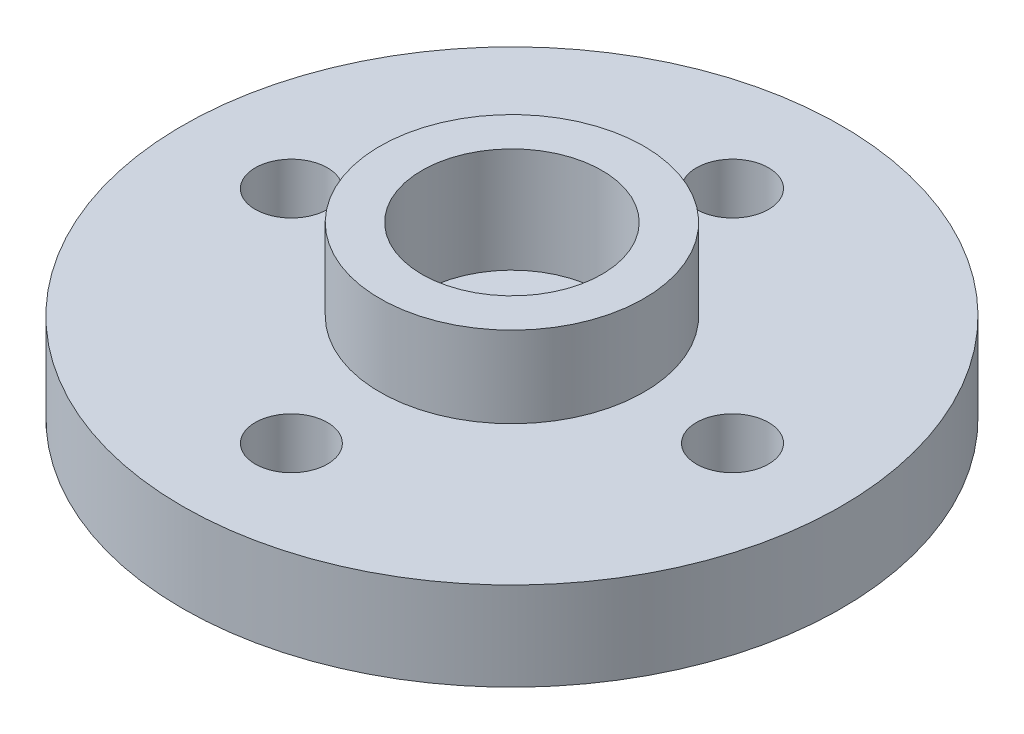
ISO-10303-21;
HEADER;
FILE_DESCRIPTION(('STEP AP214'),'2;1');
FILE_NAME('part.step','',(''),(''),'','','');
FILE_SCHEMA(('AUTOMOTIVE_DESIGN { 1 0 10303 214 1 1 1 1 }'));
ENDSEC;
DATA;
#1=APPLICATION_CONTEXT('core data for automotive mechanical design processes');
#2=APPLICATION_PROTOCOL_DEFINITION('international standard','automotive_design',2000,#1);
#3=PRODUCT_CONTEXT('',#1,'mechanical');
#4=PRODUCT('Part','Part','',(#3));
#5=PRODUCT_RELATED_PRODUCT_CATEGORY('part','',(#4));
#6=PRODUCT_DEFINITION_FORMATION('','',#4);
#7=PRODUCT_DEFINITION_CONTEXT('part definition',#1,'design');
#8=PRODUCT_DEFINITION('design','',#6,#7);
#9=PRODUCT_DEFINITION_SHAPE('','',#8);
#10=(LENGTH_UNIT() NAMED_UNIT(*) SI_UNIT(.MILLI.,.METRE.));
#11=(NAMED_UNIT(*) PLANE_ANGLE_UNIT() SI_UNIT($,.RADIAN.));
#12=(NAMED_UNIT(*) SI_UNIT($,.STERADIAN.) SOLID_ANGLE_UNIT());
#13=UNCERTAINTY_MEASURE_WITH_UNIT(LENGTH_MEASURE(1.E-05),#10,'distance_accuracy_value','');
#14=(GEOMETRIC_REPRESENTATION_CONTEXT(3) GLOBAL_UNCERTAINTY_ASSIGNED_CONTEXT((#13)) GLOBAL_UNIT_ASSIGNED_CONTEXT((#10,
#11,#12)) REPRESENTATION_CONTEXT('',''));
#15=CARTESIAN_POINT('',(0.,0.,0.));
#16=DIRECTION('',(0.,0.,1.));
#17=DIRECTION('',(1.,0.,0.));
#18=AXIS2_PLACEMENT_3D('',#15,#16,#17);
#19=CARTESIAN_POINT('',(0.,2.95,0.));
#20=DIRECTION('',(0.,-1.,0.));
#21=DIRECTION('',(0.,0.,-1.));
#22=AXIS2_PLACEMENT_3D('',#19,#20,#21);
#23=CYLINDRICAL_SURFACE('',#22,1.5689031227011);
#24=CARTESIAN_POINT('',(0.,1.05,0.));
#25=DIRECTION('',(0.,1.,0.));
#26=DIRECTION('',(0.,0.,1.));
#27=AXIS2_PLACEMENT_3D('',#24,#25,#26);
#28=CIRCLE('',#27,1.5689031227011);
#29=CARTESIAN_POINT('',(0.,1.05,1.5689031227011));
#30=VERTEX_POINT('',#29);
#31=EDGE_CURVE('E48',#30,#30,#28,.T.);
#32=ORIENTED_EDGE('',*,*,#31,.F.);
#33=EDGE_LOOP('',(#32));
#34=FACE_BOUND('',#33,.T.);
#35=CARTESIAN_POINT('',(0.,2.15,0.));
#36=DIRECTION('',(0.,1.,0.));
#37=DIRECTION('',(0.,0.,1.));
#38=AXIS2_PLACEMENT_3D('',#35,#36,#37);
#39=CIRCLE('',#38,1.5689031227011);
#40=CARTESIAN_POINT('',(0.,2.15,1.5689031227011));
#41=VERTEX_POINT('',#40);
#42=EDGE_CURVE('E34',#41,#41,#39,.T.);
#43=ORIENTED_EDGE('',*,*,#42,.T.);
#44=EDGE_LOOP('',(#43));
#45=FACE_BOUND('',#44,.T.);
#46=ADVANCED_FACE('F30',(#34,#45),#23,.F.);
#47=CARTESIAN_POINT('',(0.,2.95,0.));
#48=DIRECTION('',(0.,-1.,0.));
#49=DIRECTION('',(0.,0.,-1.));
#50=AXIS2_PLACEMENT_3D('',#47,#48,#49);
#51=CYLINDRICAL_SURFACE('',#50,10.9823218589077);
#52=CARTESIAN_POINT('',(0.,2.95,0.));
#53=DIRECTION('',(0.,1.,0.));
#54=DIRECTION('',(0.,0.,1.));
#55=AXIS2_PLACEMENT_3D('',#52,#53,#54);
#56=CIRCLE('',#55,10.9823218589077);
#57=CARTESIAN_POINT('',(0.,2.95,10.9823218589077));
#58=VERTEX_POINT('',#57);
#59=EDGE_CURVE('E10',#58,#58,#56,.T.);
#60=ORIENTED_EDGE('',*,*,#59,.F.);
#61=EDGE_LOOP('',(#60));
#62=FACE_BOUND('',#61,.T.);
#63=CARTESIAN_POINT('',(0.,0.,0.));
#64=DIRECTION('',(0.,1.,0.));
#65=DIRECTION('',(0.,0.,1.));
#66=AXIS2_PLACEMENT_3D('',#63,#64,#65);
#67=CIRCLE('',#66,10.9823218589077);
#68=CARTESIAN_POINT('',(0.,0.,10.9823218589077));
#69=VERTEX_POINT('',#68);
#70=EDGE_CURVE('E38',#69,#69,#67,.T.);
#71=ORIENTED_EDGE('',*,*,#70,.T.);
#72=EDGE_LOOP('',(#71));
#73=FACE_BOUND('',#72,.T.);
#74=ADVANCED_FACE('F32',(#62,#73),#51,.T.);
#75=CARTESIAN_POINT('',(0.,2.95,0.));
#76=DIRECTION('',(0.,1.,0.));
#77=DIRECTION('',(0.,0.,1.));
#78=AXIS2_PLACEMENT_3D('',#75,#76,#77);
#79=PLANE('',#78);
#80=CARTESIAN_POINT('',(0.,2.95,0.));
#81=DIRECTION('',(0.,1.,0.));
#82=DIRECTION('',(0.,0.,1.));
#83=AXIS2_PLACEMENT_3D('',#80,#81,#82);
#84=CIRCLE('',#83,4.4);
#85=CARTESIAN_POINT('',(0.,2.95,-4.4));
#86=VERTEX_POINT('',#85);
#87=EDGE_CURVE('E66',#86,#86,#84,.T.);
#88=ORIENTED_EDGE('',*,*,#87,.F.);
#89=EDGE_LOOP('',(#88));
#90=FACE_BOUND('',#89,.T.);
#91=CARTESIAN_POINT('',(7.35,2.95,0.));
#92=DIRECTION('',(0.,1.,0.));
#93=DIRECTION('',(0.,0.,1.));
#94=AXIS2_PLACEMENT_3D('',#91,#92,#93);
#95=CIRCLE('',#94,1.20282572740417);
#96=CARTESIAN_POINT('',(7.35,2.95,1.20282572740423));
#97=VERTEX_POINT('',#96);
#98=EDGE_CURVE('E43',#97,#97,#95,.T.);
#99=ORIENTED_EDGE('',*,*,#98,.F.);
#100=EDGE_LOOP('',(#99));
#101=FACE_BOUND('',#100,.T.);
#102=CARTESIAN_POINT('',(0.,2.95,7.35));
#103=DIRECTION('',(0.,1.,0.));
#104=DIRECTION('',(0.,0.,1.));
#105=AXIS2_PLACEMENT_3D('',#102,#103,#104);
#106=CIRCLE('',#105,1.20282572740417);
#107=CARTESIAN_POINT('',(0.,2.95,8.55282572740417));
#108=VERTEX_POINT('',#107);
#109=EDGE_CURVE('E50',#108,#108,#106,.T.);
#110=ORIENTED_EDGE('',*,*,#109,.F.);
#111=EDGE_LOOP('',(#110));
#112=FACE_BOUND('',#111,.T.);
#113=CARTESIAN_POINT('',(-7.35,2.95,0.));
#114=DIRECTION('',(0.,1.,0.));
#115=DIRECTION('',(0.,0.,1.));
#116=AXIS2_PLACEMENT_3D('',#113,#114,#115);
#117=CIRCLE('',#116,1.20282572740417);
#118=CARTESIAN_POINT('',(-7.35,2.95,1.20282572740417));
#119=VERTEX_POINT('',#118);
#120=EDGE_CURVE('E78',#119,#119,#117,.T.);
#121=ORIENTED_EDGE('',*,*,#120,.F.);
#122=EDGE_LOOP('',(#121));
#123=FACE_BOUND('',#122,.T.);
#124=CARTESIAN_POINT('',(0.,2.95,-7.35));
#125=DIRECTION('',(0.,1.,0.));
#126=DIRECTION('',(0.,0.,1.));
#127=AXIS2_PLACEMENT_3D('',#124,#125,#126);
#128=CIRCLE('',#127,1.20282572740417);
#129=CARTESIAN_POINT('',(0.,2.95,-6.14717427259582));
#130=VERTEX_POINT('',#129);
#131=EDGE_CURVE('E46',#130,#130,#128,.T.);
#132=ORIENTED_EDGE('',*,*,#131,.F.);
#133=EDGE_LOOP('',(#132));
#134=FACE_BOUND('',#133,.T.);
#135=ORIENTED_EDGE('',*,*,#59,.T.);
#136=EDGE_LOOP('',(#135));
#137=FACE_BOUND('',#136,.T.);
#138=ADVANCED_FACE('F91',(#90,#101,#112,#123,#134,#137),#79,.T.);
#139=CARTESIAN_POINT('',(0.,0.,0.));
#140=DIRECTION('',(0.,1.,0.));
#141=DIRECTION('',(0.,0.,1.));
#142=AXIS2_PLACEMENT_3D('',#139,#140,#141);
#143=PLANE('',#142);
#144=CARTESIAN_POINT('',(0.,0.,0.));
#145=DIRECTION('',(0.,1.,0.));
#146=DIRECTION('',(0.,0.,1.));
#147=AXIS2_PLACEMENT_3D('',#144,#145,#146);
#148=CIRCLE('',#147,3.13780624540219);
#149=CARTESIAN_POINT('',(0.,0.,3.13780624540219));
#150=VERTEX_POINT('',#149);
#151=EDGE_CURVE('E58',#150,#150,#148,.T.);
#152=ORIENTED_EDGE('',*,*,#151,.T.);
#153=EDGE_LOOP('',(#152));
#154=FACE_BOUND('',#153,.T.);
#155=CARTESIAN_POINT('',(7.35,0.,0.));
#156=DIRECTION('',(0.,1.,0.));
#157=DIRECTION('',(0.,0.,1.));
#158=AXIS2_PLACEMENT_3D('',#155,#156,#157);
#159=CIRCLE('',#158,1.20282572740417);
#160=CARTESIAN_POINT('',(7.35,0.,1.20282572740423));
#161=VERTEX_POINT('',#160);
#162=EDGE_CURVE('E71',#161,#161,#159,.T.);
#163=ORIENTED_EDGE('',*,*,#162,.T.);
#164=EDGE_LOOP('',(#163));
#165=FACE_BOUND('',#164,.T.);
#166=CARTESIAN_POINT('',(0.,0.,7.35));
#167=DIRECTION('',(0.,1.,0.));
#168=DIRECTION('',(0.,0.,1.));
#169=AXIS2_PLACEMENT_3D('',#166,#167,#168);
#170=CIRCLE('',#169,1.20282572740417);
#171=CARTESIAN_POINT('',(0.,0.,8.55282572740417));
#172=VERTEX_POINT('',#171);
#173=EDGE_CURVE('E55',#172,#172,#170,.T.);
#174=ORIENTED_EDGE('',*,*,#173,.T.);
#175=EDGE_LOOP('',(#174));
#176=FACE_BOUND('',#175,.T.);
#177=CARTESIAN_POINT('',(-7.35,0.,0.));
#178=DIRECTION('',(0.,1.,0.));
#179=DIRECTION('',(0.,0.,1.));
#180=AXIS2_PLACEMENT_3D('',#177,#178,#179);
#181=CIRCLE('',#180,1.20282572740417);
#182=CARTESIAN_POINT('',(-7.35,0.,1.20282572740417));
#183=VERTEX_POINT('',#182);
#184=EDGE_CURVE('E75',#183,#183,#181,.T.);
#185=ORIENTED_EDGE('',*,*,#184,.T.);
#186=EDGE_LOOP('',(#185));
#187=FACE_BOUND('',#186,.T.);
#188=CARTESIAN_POINT('',(0.,0.,-7.35));
#189=DIRECTION('',(0.,1.,0.));
#190=DIRECTION('',(0.,0.,1.));
#191=AXIS2_PLACEMENT_3D('',#188,#189,#190);
#192=CIRCLE('',#191,1.20282572740417);
#193=CARTESIAN_POINT('',(0.,0.,-6.14717427259582));
#194=VERTEX_POINT('',#193);
#195=EDGE_CURVE('E74',#194,#194,#192,.T.);
#196=ORIENTED_EDGE('',*,*,#195,.T.);
#197=EDGE_LOOP('',(#196));
#198=FACE_BOUND('',#197,.T.);
#199=ORIENTED_EDGE('',*,*,#70,.F.);
#200=EDGE_LOOP('',(#199));
#201=FACE_BOUND('',#200,.T.);
#202=ADVANCED_FACE('F93',(#154,#165,#176,#187,#198,#201),#143,.F.);
#203=CARTESIAN_POINT('',(0.,2.95,-7.35));
#204=DIRECTION('',(0.,-1.,0.));
#205=DIRECTION('',(0.,0.,-1.));
#206=AXIS2_PLACEMENT_3D('',#203,#204,#205);
#207=CYLINDRICAL_SURFACE('',#206,1.20282572740417);
#208=ORIENTED_EDGE('',*,*,#131,.T.);
#209=EDGE_LOOP('',(#208));
#210=FACE_BOUND('',#209,.T.);
#211=ORIENTED_EDGE('',*,*,#195,.F.);
#212=EDGE_LOOP('',(#211));
#213=FACE_BOUND('',#212,.T.);
#214=ADVANCED_FACE('F88',(#210,#213),#207,.F.);
#215=CARTESIAN_POINT('',(-7.35,2.95,0.));
#216=DIRECTION('',(0.,-1.,0.));
#217=DIRECTION('',(0.,0.,-1.));
#218=AXIS2_PLACEMENT_3D('',#215,#216,#217);
#219=CYLINDRICAL_SURFACE('',#218,1.20282572740417);
#220=ORIENTED_EDGE('',*,*,#120,.T.);
#221=EDGE_LOOP('',(#220));
#222=FACE_BOUND('',#221,.T.);
#223=ORIENTED_EDGE('',*,*,#184,.F.);
#224=EDGE_LOOP('',(#223));
#225=FACE_BOUND('',#224,.T.);
#226=ADVANCED_FACE('F113',(#222,#225),#219,.F.);
#227=CARTESIAN_POINT('',(0.,2.95,7.35));
#228=DIRECTION('',(0.,-1.,0.));
#229=DIRECTION('',(0.,0.,-1.));
#230=AXIS2_PLACEMENT_3D('',#227,#228,#229);
#231=CYLINDRICAL_SURFACE('',#230,1.20282572740417);
#232=ORIENTED_EDGE('',*,*,#109,.T.);
#233=EDGE_LOOP('',(#232));
#234=FACE_BOUND('',#233,.T.);
#235=ORIENTED_EDGE('',*,*,#173,.F.);
#236=EDGE_LOOP('',(#235));
#237=FACE_BOUND('',#236,.T.);
#238=ADVANCED_FACE('F114',(#234,#237),#231,.F.);
#239=CARTESIAN_POINT('',(7.35,2.95,0.));
#240=DIRECTION('',(0.,-1.,0.));
#241=DIRECTION('',(0.,0.,-1.));
#242=AXIS2_PLACEMENT_3D('',#239,#240,#241);
#243=CYLINDRICAL_SURFACE('',#242,1.20282572740417);
#244=ORIENTED_EDGE('',*,*,#98,.T.);
#245=EDGE_LOOP('',(#244));
#246=FACE_BOUND('',#245,.T.);
#247=ORIENTED_EDGE('',*,*,#162,.F.);
#248=EDGE_LOOP('',(#247));
#249=FACE_BOUND('',#248,.T.);
#250=ADVANCED_FACE('F117',(#246,#249),#243,.F.);
#251=CARTESIAN_POINT('',(0.,1.05,0.));
#252=DIRECTION('',(0.,-1.,0.));
#253=DIRECTION('',(0.,0.,-1.));
#254=AXIS2_PLACEMENT_3D('',#251,#252,#253);
#255=CYLINDRICAL_SURFACE('',#254,3.13780624540219);
#256=CARTESIAN_POINT('',(0.,1.05,0.));
#257=DIRECTION('',(0.,1.,0.));
#258=DIRECTION('',(0.,0.,1.));
#259=AXIS2_PLACEMENT_3D('',#256,#257,#258);
#260=CIRCLE('',#259,3.13780624540219);
#261=CARTESIAN_POINT('',(0.,1.05,3.13780624540219));
#262=VERTEX_POINT('',#261);
#263=EDGE_CURVE('E51',#262,#262,#260,.T.);
#264=ORIENTED_EDGE('',*,*,#263,.T.);
#265=EDGE_LOOP('',(#264));
#266=FACE_BOUND('',#265,.T.);
#267=ORIENTED_EDGE('',*,*,#151,.F.);
#268=EDGE_LOOP('',(#267));
#269=FACE_BOUND('',#268,.T.);
#270=ADVANCED_FACE('F124',(#266,#269),#255,.F.);
#271=CARTESIAN_POINT('',(0.,1.05,0.));
#272=DIRECTION('',(0.,1.,0.));
#273=DIRECTION('',(0.,0.,1.));
#274=AXIS2_PLACEMENT_3D('',#271,#272,#273);
#275=PLANE('',#274);
#276=ORIENTED_EDGE('',*,*,#31,.T.);
#277=EDGE_LOOP('',(#276));
#278=FACE_BOUND('',#277,.T.);
#279=ORIENTED_EDGE('',*,*,#263,.F.);
#280=EDGE_LOOP('',(#279));
#281=FACE_BOUND('',#280,.T.);
#282=ADVANCED_FACE('F128',(#278,#281),#275,.F.);
#283=CARTESIAN_POINT('',(0.,5.65,0.));
#284=DIRECTION('',(0.,-1.,0.));
#285=DIRECTION('',(0.,0.,-1.));
#286=AXIS2_PLACEMENT_3D('',#283,#284,#285);
#287=CYLINDRICAL_SURFACE('',#286,4.4);
#288=CARTESIAN_POINT('',(0.,5.65,0.));
#289=DIRECTION('',(0.,1.,0.));
#290=DIRECTION('',(0.,0.,1.));
#291=AXIS2_PLACEMENT_3D('',#288,#289,#290);
#292=CIRCLE('',#291,4.4);
#293=CARTESIAN_POINT('',(0.,5.65,-4.4));
#294=VERTEX_POINT('',#293);
#295=EDGE_CURVE('E63',#294,#294,#292,.T.);
#296=CARTESIAN_POINT('',(0.,5.65,-4.4));
#297=CARTESIAN_POINT('',(0.,5.621875,-4.4));
#298=CARTESIAN_POINT('',(0.,5.59375,-4.4));
#299=CARTESIAN_POINT('',(0.,5.5375,-4.4));
#300=CARTESIAN_POINT('',(0.,5.509375,-4.4));
#301=CARTESIAN_POINT('',(0.,5.453125,-4.4));
#302=CARTESIAN_POINT('',(0.,5.425,-4.4));
#303=CARTESIAN_POINT('',(0.,5.36875,-4.4));
#304=CARTESIAN_POINT('',(0.,5.340625,-4.4));
#305=CARTESIAN_POINT('',(0.,5.284375,-4.4));
#306=CARTESIAN_POINT('',(0.,5.25625,-4.4));
#307=CARTESIAN_POINT('',(0.,5.2,-4.4));
#308=CARTESIAN_POINT('',(0.,5.171875,-4.4));
#309=CARTESIAN_POINT('',(0.,5.115625,-4.4));
#310=CARTESIAN_POINT('',(0.,5.0875,-4.4));
#311=CARTESIAN_POINT('',(0.,5.03125,-4.4));
#312=CARTESIAN_POINT('',(0.,5.003125,-4.4));
#313=CARTESIAN_POINT('',(0.,4.946875,-4.4));
#314=CARTESIAN_POINT('',(0.,4.91875,-4.4));
#315=CARTESIAN_POINT('',(0.,4.8625,-4.4));
#316=CARTESIAN_POINT('',(0.,4.834375,-4.4));
#317=CARTESIAN_POINT('',(0.,4.778125,-4.4));
#318=CARTESIAN_POINT('',(0.,4.75,-4.4));
#319=CARTESIAN_POINT('',(0.,4.69375,-4.4));
#320=CARTESIAN_POINT('',(0.,4.665625,-4.4));
#321=CARTESIAN_POINT('',(0.,4.609375,-4.4));
#322=CARTESIAN_POINT('',(0.,4.58125,-4.4));
#323=CARTESIAN_POINT('',(0.,4.525,-4.4));
#324=CARTESIAN_POINT('',(0.,4.496875,-4.4));
#325=CARTESIAN_POINT('',(0.,4.440625,-4.4));
#326=CARTESIAN_POINT('',(0.,4.4125,-4.4));
#327=CARTESIAN_POINT('',(0.,4.35625,-4.4));
#328=CARTESIAN_POINT('',(0.,4.328125,-4.4));
#329=CARTESIAN_POINT('',(0.,4.271875,-4.4));
#330=CARTESIAN_POINT('',(0.,4.24375,-4.4));
#331=CARTESIAN_POINT('',(0.,4.1875,-4.4));
#332=CARTESIAN_POINT('',(0.,4.159375,-4.4));
#333=CARTESIAN_POINT('',(0.,4.103125,-4.4));
#334=CARTESIAN_POINT('',(0.,4.075,-4.4));
#335=CARTESIAN_POINT('',(0.,4.01875,-4.4));
#336=CARTESIAN_POINT('',(0.,3.990625,-4.4));
#337=CARTESIAN_POINT('',(0.,3.934375,-4.4));
#338=CARTESIAN_POINT('',(0.,3.90625,-4.4));
#339=CARTESIAN_POINT('',(0.,3.85,-4.4));
#340=CARTESIAN_POINT('',(0.,3.821875,-4.4));
#341=CARTESIAN_POINT('',(0.,3.765625,-4.4));
#342=CARTESIAN_POINT('',(0.,3.7375,-4.4));
#343=CARTESIAN_POINT('',(0.,3.68125,-4.4));
#344=CARTESIAN_POINT('',(0.,3.653125,-4.4));
#345=CARTESIAN_POINT('',(0.,3.596875,-4.4));
#346=CARTESIAN_POINT('',(0.,3.56875,-4.4));
#347=CARTESIAN_POINT('',(0.,3.5125,-4.4));
#348=CARTESIAN_POINT('',(0.,3.484375,-4.4));
#349=CARTESIAN_POINT('',(0.,3.428125,-4.4));
#350=CARTESIAN_POINT('',(0.,3.4,-4.4));
#351=CARTESIAN_POINT('',(0.,3.34375,-4.4));
#352=CARTESIAN_POINT('',(0.,3.315625,-4.4));
#353=CARTESIAN_POINT('',(0.,3.259375,-4.4));
#354=CARTESIAN_POINT('',(0.,3.23125,-4.4));
#355=CARTESIAN_POINT('',(0.,3.175,-4.4));
#356=CARTESIAN_POINT('',(0.,3.146875,-4.4));
#357=CARTESIAN_POINT('',(0.,3.090625,-4.4));
#358=CARTESIAN_POINT('',(0.,3.0625,-4.4));
#359=CARTESIAN_POINT('',(0.,3.00625,-4.4));
#360=CARTESIAN_POINT('',(0.,2.978125,-4.4));
#361=CARTESIAN_POINT('',(0.,2.95,-4.4));
#362=B_SPLINE_CURVE_WITH_KNOTS('',3,(#296,#297,#298,#299,#300,#301,#302,#303,#304,#305,#306,
#307,#308,#309,#310,#311,#312,#313,#314,#315,#316,#317,#318,#319,#320,#321,#322,#323,#324,#325,
#326,#327,#328,#329,#330,#331,#332,#333,#334,#335,#336,#337,#338,#339,#340,#341,#342,#343,#344,
#345,#346,#347,#348,#349,#350,#351,#352,#353,#354,#355,#356,#357,#358,#359,#360,#361),
.UNSPECIFIED.,.F.,.F.,(4,2,2,2,2,2,2,2,2,2,2,2,2,2,2,2,2,2,2,2,2,2,2,2,2,2,2,2,2,2,2,2,4),(0.,
0.0843749999999994,0.16875,0.253125,0.337499999999999,0.421875,0.50625,0.590625,
0.674999999999999,0.759375,0.84375,0.928124999999999,1.0125,1.096875,1.18125,1.265625,1.35,
1.434375,1.51875,1.603125,1.6875,1.771875,1.85625,1.940625,2.025,2.109375,2.19375,2.278125,
2.3625,2.446875,2.53125,2.615625,2.7),.UNSPECIFIED.);
#363=EDGE_CURVE('BSEAM131',#294,#86,#362,.T.);
#364=ORIENTED_EDGE('',*,*,#295,.F.);
#365=ORIENTED_EDGE('',*,*,#87,.T.);
#366=ORIENTED_EDGE('',*,*,#363,.T.);
#367=ORIENTED_EDGE('',*,*,#363,.F.);
#368=EDGE_LOOP('',(#364,#366,#365,#367));
#369=FACE_BOUND('',#368,.T.);
#370=ADVANCED_FACE('F131',(#369),#287,.T.);
#371=CARTESIAN_POINT('',(0.,5.65,0.));
#372=DIRECTION('',(0.,1.,0.));
#373=DIRECTION('',(0.,0.,1.));
#374=AXIS2_PLACEMENT_3D('',#371,#372,#373);
#375=PLANE('',#374);
#376=CARTESIAN_POINT('',(0.,5.65,0.));
#377=DIRECTION('',(0.,1.,0.));
#378=DIRECTION('',(0.,0.,1.));
#379=AXIS2_PLACEMENT_3D('',#376,#377,#378);
#380=CIRCLE('',#379,3.);
#381=CARTESIAN_POINT('',(0.,5.65,3.));
#382=VERTEX_POINT('',#381);
#383=EDGE_CURVE('E154',#382,#382,#380,.T.);
#384=ORIENTED_EDGE('',*,*,#383,.F.);
#385=EDGE_LOOP('',(#384));
#386=FACE_BOUND('',#385,.T.);
#387=ORIENTED_EDGE('',*,*,#295,.T.);
#388=EDGE_LOOP('',(#387));
#389=FACE_BOUND('',#388,.T.);
#390=ADVANCED_FACE('F134',(#386,#389),#375,.T.);
#391=CARTESIAN_POINT('',(0.,2.15,0.));
#392=DIRECTION('',(0.,1.,0.));
#393=DIRECTION('',(0.,0.,1.));
#394=AXIS2_PLACEMENT_3D('',#391,#392,#393);
#395=CYLINDRICAL_SURFACE('',#394,3.);
#396=CARTESIAN_POINT('',(0.,2.15,0.));
#397=DIRECTION('',(0.,1.,0.));
#398=DIRECTION('',(0.,0.,1.));
#399=AXIS2_PLACEMENT_3D('',#396,#397,#398);
#400=CIRCLE('',#399,3.);
#401=CARTESIAN_POINT('',(0.,2.15,3.));
#402=VERTEX_POINT('',#401);
#403=EDGE_CURVE('E153',#402,#402,#400,.T.);
#404=ORIENTED_EDGE('',*,*,#403,.F.);
#405=EDGE_LOOP('',(#404));
#406=FACE_BOUND('',#405,.T.);
#407=ORIENTED_EDGE('',*,*,#383,.T.);
#408=EDGE_LOOP('',(#407));
#409=FACE_BOUND('',#408,.T.);
#410=ADVANCED_FACE('F138',(#406,#409),#395,.F.);
#411=CARTESIAN_POINT('',(0.,2.15,0.));
#412=DIRECTION('',(0.,1.,0.));
#413=DIRECTION('',(0.,0.,1.));
#414=AXIS2_PLACEMENT_3D('',#411,#412,#413);
#415=PLANE('',#414);
#416=ORIENTED_EDGE('',*,*,#42,.F.);
#417=EDGE_LOOP('',(#416));
#418=FACE_BOUND('',#417,.T.);
#419=ORIENTED_EDGE('',*,*,#403,.T.);
#420=EDGE_LOOP('',(#419));
#421=FACE_BOUND('',#420,.T.);
#422=ADVANCED_FACE('F142',(#418,#421),#415,.T.);
#423=CLOSED_SHELL('',(#46,#74,#138,#202,#214,#226,#238,#250,#270,#282,#370,#390,#410,#422));
#424=MANIFOLD_SOLID_BREP('B2',#423);
#425=ADVANCED_BREP_SHAPE_REPRESENTATION('',(#18,#424),#14);
#426=SHAPE_DEFINITION_REPRESENTATION(#9,#425);
ENDSEC;
END-ISO-10303-21;
